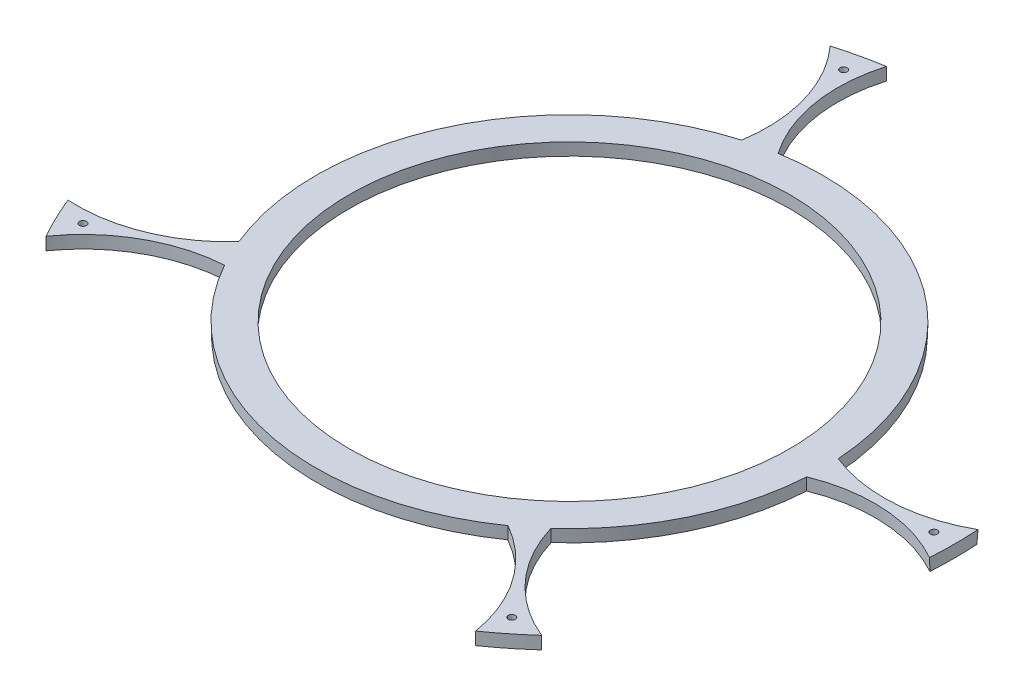
ISO-10303-21;
HEADER;
FILE_DESCRIPTION(('STEP AP214'),'2;1');
FILE_NAME('part.step','',(''),(''),'','','');
FILE_SCHEMA(('AUTOMOTIVE_DESIGN { 1 0 10303 214 1 1 1 1 }'));
ENDSEC;
DATA;
#1=APPLICATION_CONTEXT('core data for automotive mechanical design processes');
#2=APPLICATION_PROTOCOL_DEFINITION('international standard','automotive_design',2000,#1);
#3=PRODUCT_CONTEXT('',#1,'mechanical');
#4=PRODUCT('Part','Part','',(#3));
#5=PRODUCT_RELATED_PRODUCT_CATEGORY('part','',(#4));
#6=PRODUCT_DEFINITION_FORMATION('','',#4);
#7=PRODUCT_DEFINITION_CONTEXT('part definition',#1,'design');
#8=PRODUCT_DEFINITION('design','',#6,#7);
#9=PRODUCT_DEFINITION_SHAPE('','',#8);
#10=(LENGTH_UNIT() NAMED_UNIT(*) SI_UNIT(.MILLI.,.METRE.));
#11=(NAMED_UNIT(*) PLANE_ANGLE_UNIT() SI_UNIT($,.RADIAN.));
#12=(NAMED_UNIT(*) SI_UNIT($,.STERADIAN.) SOLID_ANGLE_UNIT());
#13=UNCERTAINTY_MEASURE_WITH_UNIT(LENGTH_MEASURE(1.E-05),#10,'distance_accuracy_value','');
#14=(GEOMETRIC_REPRESENTATION_CONTEXT(3) GLOBAL_UNCERTAINTY_ASSIGNED_CONTEXT((#13)) GLOBAL_UNIT_ASSIGNED_CONTEXT((#10,
#11,#12)) REPRESENTATION_CONTEXT('',''));
#15=CARTESIAN_POINT('',(0.,0.,0.));
#16=DIRECTION('',(0.,0.,1.));
#17=DIRECTION('',(1.,0.,0.));
#18=AXIS2_PLACEMENT_3D('',#15,#16,#17);
#19=CARTESIAN_POINT('',(0.,0.,0.));
#20=DIRECTION('',(0.,1.,0.));
#21=DIRECTION('',(0.,0.,1.));
#22=AXIS2_PLACEMENT_3D('',#19,#20,#21);
#23=CONICAL_SURFACE('',#22,63.5,0.0349065850398867);
#24=CARTESIAN_POINT('',(-10.3950874879848,3.191075,-62.7563287066158));
#25=CARTESIAN_POINT('',(-10.3832751510703,2.65654921550589,-62.7393649546272));
#26=CARTESIAN_POINT('',(-10.3714431933319,2.12202382325886,-62.7224025511319));
#27=CARTESIAN_POINT('',(-10.3477400362074,1.05297382325886,-62.6884804411279));
#28=CARTESIAN_POINT('',(-10.3358688368212,0.518449215505898,-62.6715207346191));
#29=CARTESIAN_POINT('',(-10.3239780166112,-0.0160749999999876,-62.6545623766036));
#30=B_SPLINE_CURVE_WITH_KNOTS('',3,(#24,#25,#26,#27,#28,#29),.UNSPECIFIED.,.F.,.F.,(4,2,4),(0.,
1.60477600300416,3.20955200600852),.UNSPECIFIED.);
#31=CARTESIAN_POINT('',(-10.3947322436658,3.175,-62.7558185492086));
#32=VERTEX_POINT('',#31);
#33=CARTESIAN_POINT('',(-10.3243356104095,0.,-62.6550723740994));
#34=VERTEX_POINT('',#33);
#35=EDGE_CURVE('E69',#32,#34,#30,.T.);
#36=ORIENTED_EDGE('',*,*,#35,.F.);
#37=CARTESIAN_POINT('',(0.,3.175,0.));
#38=DIRECTION('',(0.,1.,0.));
#39=DIRECTION('',(0.,0.,1.));
#40=AXIS2_PLACEMENT_3D('',#37,#38,#39);
#41=CIRCLE('',#40,63.6108734431363);
#42=CARTESIAN_POINT('',(63.4879267501533,3.175,-3.9530212706064));
#43=VERTEX_POINT('',#42);
#44=EDGE_CURVE('E169',#43,#32,#41,.T.);
#45=ORIENTED_EDGE('',*,*,#44,.F.);
#46=CARTESIAN_POINT('',(63.4879267501533,3.175,-3.9530212706064));
#47=CARTESIAN_POINT('',(63.4702061941256,2.64583343737004,-3.94026697601275));
#48=CARTESIAN_POINT('',(63.452481995248,2.11666682272168,-3.92751991120402));
#49=CARTESIAN_POINT('',(63.4170263117931,1.05833348938835,-3.90204024115636));
#50=CARTESIAN_POINT('',(63.3992948272158,0.529166770703372,-3.88930763591744));
#51=CARTESIAN_POINT('',(63.3815596997886,0.,-3.87658226046342));
#52=B_SPLINE_CURVE_WITH_KNOTS('',3,(#46,#47,#48,#49,#50,#51),.UNSPECIFIED.,.F.,.F.,(4,2,4),(0.,
1.58885036064113,3.17770072128174),.UNSPECIFIED.);
#53=CARTESIAN_POINT('',(63.3815596997886,0.,-3.87658226046343));
#54=VERTEX_POINT('',#53);
#55=EDGE_CURVE('E289',#43,#54,#52,.T.);
#56=ORIENTED_EDGE('',*,*,#55,.T.);
#57=CARTESIAN_POINT('',(0.,0.,0.));
#58=DIRECTION('',(0.,1.,0.));
#59=DIRECTION('',(0.,0.,1.));
#60=AXIS2_PLACEMENT_3D('',#57,#58,#59);
#61=CIRCLE('',#60,63.5);
#62=EDGE_CURVE('E284',#54,#34,#61,.T.);
#63=ORIENTED_EDGE('',*,*,#62,.T.);
#64=EDGE_LOOP('',(#36,#45,#56,#63));
#65=FACE_BOUND('',#64,.T.);
#66=ADVANCED_FACE('F41',(#65),#23,.T.);
#67=CARTESIAN_POINT('',(-17.8633990617881,3.175,-61.0511440855781));
#68=VERTEX_POINT('',#67);
#69=CARTESIAN_POINT('',(-58.8693536283549,3.175,24.0985979587693));
#70=VERTEX_POINT('',#69);
#71=EDGE_CURVE('E61',#68,#70,#41,.T.);
#72=ORIENTED_EDGE('',*,*,#71,.F.);
#73=CARTESIAN_POINT('',(-17.8633003467196,3.191075,-61.0517578562531));
#74=CARTESIAN_POINT('',(-17.8665825983945,2.65654921550589,-61.0313488629204));
#75=CARTESIAN_POINT('',(-17.8698831129101,2.12202382325885,-61.0109325713817));
#76=CARTESIAN_POINT('',(-17.876520667623,1.05297382325885,-60.9700853918924));
#77=CARTESIAN_POINT('',(-17.8798577078202,0.518449215505887,-60.9496545039417));
#78=CARTESIAN_POINT('',(-17.8832130108582,-0.0160750000000003,-60.9292163177851));
#79=B_SPLINE_CURVE_WITH_KNOTS('',3,(#73,#74,#75,#76,#77,#78),.UNSPECIFIED.,.F.,.F.,(4,2,4),(0.,
1.60477600300416,3.20955200600853),.UNSPECIFIED.);
#80=CARTESIAN_POINT('',(-17.883112109599,0.,-60.9298309637858));
#81=VERTEX_POINT('',#80);
#82=EDGE_CURVE('E203',#68,#81,#79,.T.);
#83=ORIENTED_EDGE('',*,*,#82,.T.);
#84=CARTESIAN_POINT('',(-58.7867980947749,0.,24.0075481831063));
#85=VERTEX_POINT('',#84);
#86=EDGE_CURVE('E287',#81,#85,#61,.T.);
#87=ORIENTED_EDGE('',*,*,#86,.T.);
#88=CARTESIAN_POINT('',(-58.8697719457532,3.191075,24.0990578170742));
#89=CARTESIAN_POINT('',(-58.8558620026866,2.65654921550589,24.0837668501723));
#90=CARTESIAN_POINT('',(-58.8419577403478,2.12202382325885,24.0684570544494));
#91=CARTESIAN_POINT('',(-58.8141605771258,1.05297382325885,24.037799805362));
#92=CARTESIAN_POINT('',(-58.8002676762425,0.518449215505887,24.0224523519975));
#93=CARTESIAN_POINT('',(-58.7863804560871,-0.0160750000000004,24.007086069812));
#94=B_SPLINE_CURVE_WITH_KNOTS('',3,(#88,#89,#90,#91,#92,#93),.UNSPECIFIED.,.F.,.F.,(4,2,4),(0.,
1.60477600300416,3.20955200600853),.UNSPECIFIED.);
#95=EDGE_CURVE('E240',#70,#85,#94,.T.);
#96=ORIENTED_EDGE('',*,*,#95,.F.);
#97=EDGE_LOOP('',(#72,#83,#87,#96));
#98=FACE_BOUND('',#97,.T.);
#99=ADVANCED_FACE('F364',(#98),#23,.T.);
#100=CARTESIAN_POINT('',(-55.5454841968008,3.175,31.0006839528044));
#101=VERTEX_POINT('',#100);
#102=CARTESIAN_POINT('',(36.5940593452384,3.175,52.0309334995623));
#103=VERTEX_POINT('',#102);
#104=EDGE_CURVE('E375',#101,#103,#41,.T.);
#105=ORIENTED_EDGE('',*,*,#104,.F.);
#106=CARTESIAN_POINT('',(-55.5461045451327,3.191075,31.0007242895526));
#107=CARTESIAN_POINT('',(-55.525476878165,2.65654921550589,30.9993828200677));
#108=CARTESIAN_POINT('',(-55.5048380321081,2.12202382325885,30.9980575315325));
#109=CARTESIAN_POINT('',(-55.4635379818162,1.05297382325885,30.9954393163612));
#110=CARTESIAN_POINT('',(-55.4428767775811,0.518449215505887,30.9941463897252));
#111=CARTESIAN_POINT('',(-55.4222043942569,-0.0160750000000003,30.9928696440389));
#112=B_SPLINE_CURVE_WITH_KNOTS('',3,(#106,#107,#108,#109,#110,#111),.UNSPECIFIED.,.F.,.F.,(4,2,
4),(0.,1.60477600300416,3.20955200600853),.UNSPECIFIED.);
#113=CARTESIAN_POINT('',(-55.4228260824416,0.,30.992908044187));
#114=VERTEX_POINT('',#113);
#115=EDGE_CURVE('E232',#101,#114,#112,.T.);
#116=ORIENTED_EDGE('',*,*,#115,.T.);
#117=CARTESIAN_POINT('',(36.4869220431112,0.,51.9707082866871));
#118=VERTEX_POINT('',#117);
#119=EDGE_CURVE('E617',#114,#118,#61,.T.);
#120=ORIENTED_EDGE('',*,*,#119,.T.);
#121=CARTESIAN_POINT('',(36.5946007583137,3.191075,52.0312390007705));
#122=CARTESIAN_POINT('',(36.5765979143543,2.65654921550589,52.0210803692541));
#123=CARTESIAN_POINT('',(36.5585779777327,2.12202382325885,52.0109314658447));
#124=CARTESIAN_POINT('',(36.5225039191651,1.05297382325885,51.9906531152395));
#125=CARTESIAN_POINT('',(36.5044497972192,0.518449215505887,51.9805236680438));
#126=CARTESIAN_POINT('',(36.4863785826111,-0.0160749999999998,51.970403948955));
#127=B_SPLINE_CURVE_WITH_KNOTS('',3,(#121,#122,#123,#124,#125,#126),.UNSPECIFIED.,.F.,.F.,(4,2,
4),(0.,1.60477600300416,3.20955200600853),.UNSPECIFIED.);
#128=EDGE_CURVE('E54',#103,#118,#127,.T.);
#129=ORIENTED_EDGE('',*,*,#128,.F.);
#130=EDGE_LOOP('',(#105,#116,#120,#129));
#131=FACE_BOUND('',#130,.T.);
#132=ADVANCED_FACE('F353',(#131),#23,.T.);
#133=CARTESIAN_POINT('',(0.,3.175,0.));
#134=DIRECTION('',(0.,1.,0.));
#135=DIRECTION('',(0.,0.,1.));
#136=AXIS2_PLACEMENT_3D('',#133,#134,#135);
#137=PLANE('',#136);
#138=CARTESIAN_POINT('',(-20.3473142009645,3.175,-89.1474082899061));
#139=DIRECTION('',(0.,1.,0.));
#140=DIRECTION('',(0.974927912181826,0.,-0.222520933956305));
#141=AXIS2_PLACEMENT_3D('',#138,#139,#140);
#142=CIRCLE('',#141,0.889000000000003);
#143=CARTESIAN_POINT('',(-19.4806032870349,3.175,-89.3452294001933));
#144=VERTEX_POINT('',#143);
#145=EDGE_CURVE('E577',#144,#144,#142,.T.);
#146=ORIENTED_EDGE('',*,*,#145,.F.);
#147=EDGE_LOOP('',(#146));
#148=FACE_BOUND('',#147,.T.);
#149=CARTESIAN_POINT('',(-82.3845932809974,3.175,39.674329104909));
#150=DIRECTION('',(0.,1.,0.));
#151=DIRECTION('',(-0.433883739117553,0.,-0.900968867902422));
#152=AXIS2_PLACEMENT_3D('',#149,#150,#151);
#153=CIRCLE('',#152,0.889000000000003);
#154=CARTESIAN_POINT('',(-82.7703159250729,3.175,38.8733677813438));
#155=VERTEX_POINT('',#154);
#156=EDGE_CURVE('E579',#155,#155,#153,.T.);
#157=ORIENTED_EDGE('',*,*,#156,.F.);
#158=EDGE_LOOP('',(#157));
#159=FACE_BOUND('',#158,.T.);
#160=CARTESIAN_POINT('',(57.0119074819625,3.175,71.4906707568768));
#161=DIRECTION('',(0.,1.,0.));
#162=DIRECTION('',(-0.781831482468031,0.,0.623489801858732));
#163=AXIS2_PLACEMENT_3D('',#160,#161,#162);
#164=CIRCLE('',#163,0.889000000000003);
#165=CARTESIAN_POINT('',(56.3168592940484,3.175,72.0449531907292));
#166=VERTEX_POINT('',#165);
#167=EDGE_CURVE('E189',#166,#166,#164,.T.);
#168=ORIENTED_EDGE('',*,*,#167,.F.);
#169=EDGE_LOOP('',(#168));
#170=FACE_BOUND('',#169,.T.);
#171=ORIENTED_EDGE('',*,*,#44,.T.);
#172=CARTESIAN_POINT('',(20.8714555891353,3.175,-84.5281748388711));
#173=DIRECTION('',(0.,-1.,0.));
#174=DIRECTION('',(-0.974927912181826,0.,0.222520933956305));
#175=AXIS2_PLACEMENT_3D('',#172,#173,#174);
#176=CIRCLE('',#175,38.1);
#177=CARTESIAN_POINT('',(-15.6929901278225,3.175,-95.2357100086311));
#178=VERTEX_POINT('',#177);
#179=EDGE_CURVE('E160',#32,#178,#176,.T.);
#180=ORIENTED_EDGE('',*,*,#179,.T.);
#181=CARTESIAN_POINT('',(0.,3.175,0.));
#182=DIRECTION('',(0.,-1.,0.));
#183=DIRECTION('',(-0.974927912181826,0.,0.222520933956305));
#184=AXIS2_PLACEMENT_3D('',#181,#182,#183);
#185=CIRCLE('',#184,96.52);
#186=CARTESIAN_POINT('',(-27.1823304065904,3.175,-92.6133430649545));
#187=VERTEX_POINT('',#186);
#188=EDGE_CURVE('E166',#178,#187,#185,.F.);
#189=ORIENTED_EDGE('',*,*,#188,.T.);
#190=CARTESIAN_POINT('',(-55.4799322734896,3.175,-67.1014687985964));
#191=DIRECTION('',(0.,-1.,0.));
#192=DIRECTION('',(-0.974927912181826,0.,0.222520933956305));
#193=AXIS2_PLACEMENT_3D('',#190,#191,#192);
#194=CIRCLE('',#193,38.1);
#195=EDGE_CURVE('E171',#68,#187,#194,.F.);
#196=ORIENTED_EDGE('',*,*,#195,.F.);
#197=ORIENTED_EDGE('',*,*,#71,.T.);
#198=CARTESIAN_POINT('',(-87.0532128069228,3.175,-1.53887621094279));
#199=DIRECTION('',(0.,-1.,0.));
#200=DIRECTION('',(0.433883739117553,0.,0.900968867902422));
#201=AXIS2_PLACEMENT_3D('',#198,#199,#200);
#202=CIRCLE('',#201,38.1);
#203=CARTESIAN_POINT('',(-89.3559331040579,3.175,36.4914732383216));
#204=VERTEX_POINT('',#203);
#205=EDGE_CURVE('E388',#70,#204,#202,.T.);
#206=ORIENTED_EDGE('',*,*,#205,.T.);
#207=CARTESIAN_POINT('',(0.,3.175,0.));
#208=DIRECTION('',(0.,-1.,0.));
#209=DIRECTION('',(0.433883739117553,0.,0.900968867902422));
#210=AXIS2_PLACEMENT_3D('',#207,#208,#209);
#211=CIRCLE('',#210,96.52);
#212=CARTESIAN_POINT('',(-84.2426956453113,3.175,47.1092202271642));
#213=VERTEX_POINT('',#212);
#214=EDGE_CURVE('E385',#204,#213,#211,.F.);
#215=ORIENTED_EDGE('',*,*,#214,.T.);
#216=CARTESIAN_POINT('',(-53.0736485348191,3.175,69.0204160462866));
#217=DIRECTION('',(0.,-1.,0.));
#218=DIRECTION('',(0.433883739117553,0.,0.900968867902422));
#219=AXIS2_PLACEMENT_3D('',#216,#217,#218);
#220=CIRCLE('',#219,38.1);
#221=EDGE_CURVE('E380',#101,#213,#220,.F.);
#222=ORIENTED_EDGE('',*,*,#221,.F.);
#223=ORIENTED_EDGE('',*,*,#104,.T.);
#224=CARTESIAN_POINT('',(17.8708688462539,3.175,85.2130391822753));
#225=DIRECTION('',(0.,-1.,0.));
#226=DIRECTION('',(0.781831482468031,0.,-0.623489801858732));
#227=AXIS2_PLACEMENT_3D('',#224,#225,#226);
#228=CIRCLE('',#227,38.1);
#229=CARTESIAN_POINT('',(55.460121505529,3.175,78.9954765957644));
#230=VERTEX_POINT('',#229);
#231=EDGE_CURVE('E248',#103,#230,#228,.T.);
#232=ORIENTED_EDGE('',*,*,#231,.T.);
#233=CARTESIAN_POINT('',(0.,3.175,0.));
#234=DIRECTION('',(0.,-1.,0.));
#235=DIRECTION('',(0.781831482468031,0.,-0.623489801858732));
#236=AXIS2_PLACEMENT_3D('',#233,#234,#235);
#237=CIRCLE('',#236,96.52);
#238=CARTESIAN_POINT('',(64.6738570345755,3.175,71.6477676991496));
#239=VERTEX_POINT('',#238);
#240=EDGE_CURVE('E245',#230,#239,#237,.F.);
#241=ORIENTED_EDGE('',*,*,#240,.T.);
#242=CARTESIAN_POINT('',(79.0999279543643,3.175,36.3844939172497));
#243=DIRECTION('',(0.,-1.,0.));
#244=DIRECTION('',(0.781831482468031,0.,-0.623489801858732));
#245=AXIS2_PLACEMENT_3D('',#242,#243,#244);
#246=CIRCLE('',#245,38.1);
#247=CARTESIAN_POINT('',(42.5834651028442,3.175,47.2545417926527));
#248=VERTEX_POINT('',#247);
#249=EDGE_CURVE('E251',#248,#239,#246,.F.);
#250=ORIENTED_EDGE('',*,*,#249,.F.);
#251=CARTESIAN_POINT('',(63.4879267501533,3.175,3.9530212706064));
#252=VERTEX_POINT('',#251);
#253=EDGE_CURVE('E286',#248,#252,#41,.T.);
#254=ORIENTED_EDGE('',*,*,#253,.T.);
#255=CARTESIAN_POINT('',(77.764541225479,3.175,39.1574530324788));
#256=DIRECTION('',(0.,1.,0.));
#257=DIRECTION('',(0.,0.,1.));
#258=AXIS2_PLACEMENT_3D('',#255,#256,#257);
#259=CIRCLE('',#258,37.9891265568637);
#260=CARTESIAN_POINT('',(96.4396881604208,3.175,6.07554523513829));
#261=VERTEX_POINT('',#260);
#262=EDGE_CURVE('E327',#252,#261,#259,.F.);
#263=ORIENTED_EDGE('',*,*,#262,.T.);
#264=CARTESIAN_POINT('',(0.,3.175,0.));
#265=DIRECTION('',(0.,1.,0.));
#266=DIRECTION('',(0.,0.,1.));
#267=AXIS2_PLACEMENT_3D('',#264,#265,#266);
#268=CIRCLE('',#267,96.6308734431363);
#269=CARTESIAN_POINT('',(96.4396881604208,3.175,-6.07554523513829));
#270=VERTEX_POINT('',#269);
#271=EDGE_CURVE('E278',#261,#270,#268,.T.);
#272=ORIENTED_EDGE('',*,*,#271,.T.);
#273=CARTESIAN_POINT('',(77.764541225479,3.175,-39.1574530324788));
#274=DIRECTION('',(0.,1.,0.));
#275=DIRECTION('',(0.,0.,1.));
#276=AXIS2_PLACEMENT_3D('',#273,#274,#275);
#277=CIRCLE('',#276,37.9891265568637);
#278=EDGE_CURVE('E319',#43,#270,#277,.T.);
#279=ORIENTED_EDGE('',*,*,#278,.F.);
#280=EDGE_LOOP('',(#171,#180,#189,#196,#197,#206,#215,#222,#223,#232,#241,#250,#254,#263,#272,#279));
#281=FACE_BOUND('',#280,.T.);
#282=CARTESIAN_POINT('',(91.44,3.175,0.));
#283=DIRECTION('',(0.,1.,0.));
#284=DIRECTION('',(0.,0.,1.));
#285=AXIS2_PLACEMENT_3D('',#282,#283,#284);
#286=CIRCLE('',#285,0.889000000000003);
#287=CARTESIAN_POINT('',(91.44,3.175,0.889000000000003));
#288=VERTEX_POINT('',#287);
#289=EDGE_CURVE('E262',#288,#288,#286,.T.);
#290=ORIENTED_EDGE('',*,*,#289,.F.);
#291=EDGE_LOOP('',(#290));
#292=FACE_BOUND('',#291,.T.);
#293=CARTESIAN_POINT('',(0.,3.175,0.));
#294=DIRECTION('',(0.,1.,0.));
#295=DIRECTION('',(0.,0.,1.));
#296=AXIS2_PLACEMENT_3D('',#293,#294,#295);
#297=CIRCLE('',#296,55.2611265568637);
#298=CARTESIAN_POINT('',(0.,3.175,55.2611265568637));
#299=VERTEX_POINT('',#298);
#300=EDGE_CURVE('E282',#299,#299,#297,.T.);
#301=ORIENTED_EDGE('',*,*,#300,.F.);
#302=EDGE_LOOP('',(#301));
#303=FACE_BOUND('',#302,.T.);
#304=ADVANCED_FACE('F162',(#148,#159,#170,#281,#292,#303),#137,.T.);
#305=CARTESIAN_POINT('',(0.,0.,0.));
#306=DIRECTION('',(0.,1.,0.));
#307=DIRECTION('',(0.,0.,1.));
#308=AXIS2_PLACEMENT_3D('',#305,#306,#307);
#309=PLANE('',#308);
#310=CARTESIAN_POINT('',(-20.3473142009645,0.,-89.1474082899061));
#311=DIRECTION('',(0.,1.,0.));
#312=DIRECTION('',(0.974927912181826,0.,-0.222520933956305));
#313=AXIS2_PLACEMENT_3D('',#310,#311,#312);
#314=CIRCLE('',#313,0.889000000000003);
#315=CARTESIAN_POINT('',(-19.4806032870349,0.,-89.3452294001933));
#316=VERTEX_POINT('',#315);
#317=EDGE_CURVE('E574',#316,#316,#314,.T.);
#318=ORIENTED_EDGE('',*,*,#317,.T.);
#319=EDGE_LOOP('',(#318));
#320=FACE_BOUND('',#319,.T.);
#321=CARTESIAN_POINT('',(-82.3845932809974,0.,39.674329104909));
#322=DIRECTION('',(0.,1.,0.));
#323=DIRECTION('',(-0.433883739117553,0.,-0.900968867902422));
#324=AXIS2_PLACEMENT_3D('',#321,#322,#323);
#325=CIRCLE('',#324,0.889000000000003);
#326=CARTESIAN_POINT('',(-82.7703159250729,0.,38.8733677813438));
#327=VERTEX_POINT('',#326);
#328=EDGE_CURVE('E582',#327,#327,#325,.T.);
#329=ORIENTED_EDGE('',*,*,#328,.T.);
#330=EDGE_LOOP('',(#329));
#331=FACE_BOUND('',#330,.T.);
#332=CARTESIAN_POINT('',(57.0119074819625,0.,71.4906707568768));
#333=DIRECTION('',(0.,1.,0.));
#334=DIRECTION('',(-0.781831482468031,0.,0.623489801858732));
#335=AXIS2_PLACEMENT_3D('',#332,#333,#334);
#336=CIRCLE('',#335,0.889000000000003);
#337=CARTESIAN_POINT('',(56.3168592940484,0.,72.0449531907292));
#338=VERTEX_POINT('',#337);
#339=EDGE_CURVE('E195',#338,#338,#336,.T.);
#340=ORIENTED_EDGE('',*,*,#339,.T.);
#341=EDGE_LOOP('',(#340));
#342=FACE_BOUND('',#341,.T.);
#343=CARTESIAN_POINT('',(91.44,0.,0.));
#344=DIRECTION('',(0.,1.,0.));
#345=DIRECTION('',(0.,0.,1.));
#346=AXIS2_PLACEMENT_3D('',#343,#344,#345);
#347=CIRCLE('',#346,0.889000000000003);
#348=CARTESIAN_POINT('',(91.44,0.,0.889000000000003));
#349=VERTEX_POINT('',#348);
#350=EDGE_CURVE('E265',#349,#349,#347,.T.);
#351=ORIENTED_EDGE('',*,*,#350,.T.);
#352=EDGE_LOOP('',(#351));
#353=FACE_BOUND('',#352,.T.);
#354=ORIENTED_EDGE('',*,*,#62,.F.);
#355=CARTESIAN_POINT('',(77.764541225479,0.,-39.1574530324788));
#356=DIRECTION('',(0.,-1.,0.));
#357=DIRECTION('',(0.,0.,-1.));
#358=AXIS2_PLACEMENT_3D('',#355,#356,#357);
#359=CIRCLE('',#358,38.1);
#360=CARTESIAN_POINT('',(96.3399707436786,0.,-5.89240503590441));
#361=VERTEX_POINT('',#360);
#362=EDGE_CURVE('E275',#54,#361,#359,.F.);
#363=ORIENTED_EDGE('',*,*,#362,.T.);
#364=CARTESIAN_POINT('',(0.,0.,0.));
#365=DIRECTION('',(0.,-1.,0.));
#366=DIRECTION('',(0.,0.,-1.));
#367=AXIS2_PLACEMENT_3D('',#364,#365,#366);
#368=CIRCLE('',#367,96.52);
#369=CARTESIAN_POINT('',(96.3399707436786,0.,5.89240503590441));
#370=VERTEX_POINT('',#369);
#371=EDGE_CURVE('E268',#370,#361,#368,.F.);
#372=ORIENTED_EDGE('',*,*,#371,.F.);
#373=CARTESIAN_POINT('',(77.764541225479,0.,39.1574530324788));
#374=DIRECTION('',(0.,-1.,0.));
#375=DIRECTION('',(0.,0.,-1.));
#376=AXIS2_PLACEMENT_3D('',#373,#374,#375);
#377=CIRCLE('',#376,38.1);
#378=CARTESIAN_POINT('',(63.3815596997886,0.,3.87658226046343));
#379=VERTEX_POINT('',#378);
#380=EDGE_CURVE('E273',#379,#370,#377,.T.);
#381=ORIENTED_EDGE('',*,*,#380,.F.);
#382=CARTESIAN_POINT('',(42.548590154326,0.,47.1366892757563));
#383=VERTEX_POINT('',#382);
#384=EDGE_CURVE('E288',#383,#379,#61,.T.);
#385=ORIENTED_EDGE('',*,*,#384,.F.);
#386=CARTESIAN_POINT('',(79.0999279543643,0.,36.3844939172497));
#387=DIRECTION('',(0.,-1.,0.));
#388=DIRECTION('',(0.781831482468031,0.,-0.623489801858732));
#389=AXIS2_PLACEMENT_3D('',#386,#387,#388);
#390=CIRCLE('',#389,38.1);
#391=CARTESIAN_POINT('',(64.6738570345755,0.,71.6477676991496));
#392=VERTEX_POINT('',#391);
#393=EDGE_CURVE('E249',#383,#392,#390,.F.);
#394=ORIENTED_EDGE('',*,*,#393,.T.);
#395=CARTESIAN_POINT('',(0.,0.,0.));
#396=DIRECTION('',(0.,-1.,0.));
#397=DIRECTION('',(0.781831482468031,0.,-0.623489801858732));
#398=AXIS2_PLACEMENT_3D('',#395,#396,#397);
#399=CIRCLE('',#398,96.52);
#400=CARTESIAN_POINT('',(55.460121505529,0.,78.9954765957644));
#401=VERTEX_POINT('',#400);
#402=EDGE_CURVE('E239',#401,#392,#399,.F.);
#403=ORIENTED_EDGE('',*,*,#402,.F.);
#404=CARTESIAN_POINT('',(17.8708688462539,0.,85.2130391822753));
#405=DIRECTION('',(0.,-1.,0.));
#406=DIRECTION('',(0.781831482468031,0.,-0.623489801858732));
#407=AXIS2_PLACEMENT_3D('',#404,#405,#406);
#408=CIRCLE('',#407,38.1);
#409=EDGE_CURVE('E256',#118,#401,#408,.T.);
#410=ORIENTED_EDGE('',*,*,#409,.F.);
#411=ORIENTED_EDGE('',*,*,#119,.F.);
#412=CARTESIAN_POINT('',(-53.0736485348191,0.,69.0204160462866));
#413=DIRECTION('',(0.,-1.,0.));
#414=DIRECTION('',(0.433883739117553,0.,0.900968867902422));
#415=AXIS2_PLACEMENT_3D('',#412,#413,#414);
#416=CIRCLE('',#415,38.1);
#417=CARTESIAN_POINT('',(-84.2426956453113,0.,47.1092202271642));
#418=VERTEX_POINT('',#417);
#419=EDGE_CURVE('E383',#114,#418,#416,.F.);
#420=ORIENTED_EDGE('',*,*,#419,.T.);
#421=CARTESIAN_POINT('',(0.,0.,0.));
#422=DIRECTION('',(0.,-1.,0.));
#423=DIRECTION('',(0.433883739117553,0.,0.900968867902422));
#424=AXIS2_PLACEMENT_3D('',#421,#422,#423);
#425=CIRCLE('',#424,96.52);
#426=CARTESIAN_POINT('',(-89.3559331040579,0.,36.4914732383216));
#427=VERTEX_POINT('',#426);
#428=EDGE_CURVE('E394',#427,#418,#425,.F.);
#429=ORIENTED_EDGE('',*,*,#428,.F.);
#430=CARTESIAN_POINT('',(-87.0532128069228,0.,-1.53887621094279));
#431=DIRECTION('',(0.,-1.,0.));
#432=DIRECTION('',(0.433883739117553,0.,0.900968867902422));
#433=AXIS2_PLACEMENT_3D('',#430,#431,#432);
#434=CIRCLE('',#433,38.1);
#435=EDGE_CURVE('E397',#85,#427,#434,.T.);
#436=ORIENTED_EDGE('',*,*,#435,.F.);
#437=ORIENTED_EDGE('',*,*,#86,.F.);
#438=CARTESIAN_POINT('',(-55.4799322734896,0.,-67.1014687985964));
#439=DIRECTION('',(0.,-1.,0.));
#440=DIRECTION('',(-0.974927912181826,0.,0.222520933956305));
#441=AXIS2_PLACEMENT_3D('',#438,#439,#440);
#442=CIRCLE('',#441,38.1);
#443=CARTESIAN_POINT('',(-27.1823304065904,0.,-92.6133430649545));
#444=VERTEX_POINT('',#443);
#445=EDGE_CURVE('E184',#81,#444,#442,.F.);
#446=ORIENTED_EDGE('',*,*,#445,.T.);
#447=CARTESIAN_POINT('',(0.,0.,0.));
#448=DIRECTION('',(0.,-1.,0.));
#449=DIRECTION('',(-0.974927912181826,0.,0.222520933956305));
#450=AXIS2_PLACEMENT_3D('',#447,#448,#449);
#451=CIRCLE('',#450,96.52);
#452=CARTESIAN_POINT('',(-15.6929901278225,0.,-95.2357100086311));
#453=VERTEX_POINT('',#452);
#454=EDGE_CURVE('E193',#453,#444,#451,.F.);
#455=ORIENTED_EDGE('',*,*,#454,.F.);
#456=CARTESIAN_POINT('',(20.8714555891353,0.,-84.5281748388711));
#457=DIRECTION('',(0.,-1.,0.));
#458=DIRECTION('',(-0.974927912181826,0.,0.222520933956305));
#459=AXIS2_PLACEMENT_3D('',#456,#457,#458);
#460=CIRCLE('',#459,38.1);
#461=EDGE_CURVE('E177',#34,#453,#460,.T.);
#462=ORIENTED_EDGE('',*,*,#461,.F.);
#463=EDGE_LOOP('',(#354,#363,#372,#381,#385,#394,#403,#410,#411,#420,#429,#436,#437,#446,#455,#462));
#464=FACE_BOUND('',#463,.T.);
#465=CARTESIAN_POINT('',(0.,0.,0.));
#466=DIRECTION('',(0.,1.,0.));
#467=DIRECTION('',(0.,0.,1.));
#468=AXIS2_PLACEMENT_3D('',#465,#466,#467);
#469=CIRCLE('',#468,55.372);
#470=CARTESIAN_POINT('',(0.,0.,55.372));
#471=VERTEX_POINT('',#470);
#472=EDGE_CURVE('E279',#471,#471,#469,.T.);
#473=ORIENTED_EDGE('',*,*,#472,.T.);
#474=EDGE_LOOP('',(#473));
#475=FACE_BOUND('',#474,.T.);
#476=ADVANCED_FACE('F352',(#320,#331,#342,#353,#464,#475),#309,.F.);
#477=ORIENTED_EDGE('',*,*,#253,.F.);
#478=CARTESIAN_POINT('',(42.5836424687561,3.191075,47.2551376117859));
#479=CARTESIAN_POINT('',(42.5777445449929,2.65654921550589,47.2353256285385));
#480=CARTESIAN_POINT('',(42.5718599089079,2.12202382325885,47.2154991458851));
#481=CARTESIAN_POINT('',(42.5601172120939,1.05297382325885,47.1758171817662));
#482=CARTESIAN_POINT('',(42.554259151365,0.518449215505888,47.1559617003007));
#483=CARTESIAN_POINT('',(42.5484143783142,-0.0160749999999995,47.1360917194292));
#484=B_SPLINE_CURVE_WITH_KNOTS('',3,(#478,#479,#480,#481,#482,#483),.UNSPECIFIED.,.F.,.F.,(4,2,
4),(0.,1.60477600300416,3.20955200600853),.UNSPECIFIED.);
#485=EDGE_CURVE('E11',#248,#383,#484,.T.);
#486=ORIENTED_EDGE('',*,*,#485,.T.);
#487=ORIENTED_EDGE('',*,*,#384,.T.);
#488=CARTESIAN_POINT('',(63.4879267501533,3.175,3.9530212706064));
#489=CARTESIAN_POINT('',(63.4702061941256,2.64583343737004,3.94026697601275));
#490=CARTESIAN_POINT('',(63.452481995248,2.11666682272168,3.92751991120402));
#491=CARTESIAN_POINT('',(63.4170263117931,1.05833348938835,3.90204024115636));
#492=CARTESIAN_POINT('',(63.3992948272158,0.529166770703372,3.88930763591744));
#493=CARTESIAN_POINT('',(63.3815596997886,0.,3.87658226046342));
#494=B_SPLINE_CURVE_WITH_KNOTS('',3,(#488,#489,#490,#491,#492,#493),.UNSPECIFIED.,.F.,.F.,(4,2,
4),(0.,1.58885036064113,3.17770072128174),.UNSPECIFIED.);
#495=EDGE_CURVE('E295',#252,#379,#494,.T.);
#496=ORIENTED_EDGE('',*,*,#495,.F.);
#497=EDGE_LOOP('',(#477,#486,#487,#496));
#498=FACE_BOUND('',#497,.T.);
#499=ADVANCED_FACE('F209',(#498),#23,.T.);
#500=CARTESIAN_POINT('',(0.,0.,0.));
#501=DIRECTION('',(0.,-1.,0.));
#502=DIRECTION('',(0.,0.,1.));
#503=AXIS2_PLACEMENT_3D('',#500,#501,#502);
#504=CONICAL_SURFACE('',#503,55.372,0.0349065850398867);
#505=ORIENTED_EDGE('',*,*,#300,.T.);
#506=EDGE_LOOP('',(#505));
#507=FACE_BOUND('',#506,.T.);
#508=ORIENTED_EDGE('',*,*,#472,.F.);
#509=EDGE_LOOP('',(#508));
#510=FACE_BOUND('',#509,.T.);
#511=ADVANCED_FACE('F43',(#507,#510),#504,.F.);
#512=CARTESIAN_POINT('',(0.,0.,0.));
#513=DIRECTION('',(0.,1.,0.));
#514=DIRECTION('',(0.,0.,-1.));
#515=AXIS2_PLACEMENT_3D('',#512,#513,#514);
#516=CONICAL_SURFACE('',#515,96.52,0.0349065850398867);
#517=ORIENTED_EDGE('',*,*,#371,.T.);
#518=CARTESIAN_POINT('',(96.4396881604208,3.175,-6.07554523513829));
#519=CARTESIAN_POINT('',(96.42309942908,2.64583587976127,-6.04496093158767));
#520=CARTESIAN_POINT('',(96.406495278681,2.11667048630692,-6.01440709654277));
#521=CARTESIAN_POINT('',(96.373256139767,1.05833715297359,-5.95336036346482));
#522=CARTESIAN_POINT('',(96.3566211512519,0.5291692130946,-5.92286746543175));
#523=CARTESIAN_POINT('',(96.3399707436786,0.,-5.89240503590441));
#524=B_SPLINE_CURVE_WITH_KNOTS('',3,(#518,#519,#520,#521,#522,#523),.UNSPECIFIED.,.F.,.F.,(4,2,
4),(0.,1.59092024768214,3.18184049534453),.UNSPECIFIED.);
#525=EDGE_CURVE('E283',#270,#361,#524,.T.);
#526=ORIENTED_EDGE('',*,*,#525,.F.);
#527=ORIENTED_EDGE('',*,*,#271,.F.);
#528=CARTESIAN_POINT('',(96.4396881604208,3.175,6.07554523513829));
#529=CARTESIAN_POINT('',(96.42309942908,2.64583587976127,6.04496093158767));
#530=CARTESIAN_POINT('',(96.406495278681,2.11667048630692,6.01440709654277));
#531=CARTESIAN_POINT('',(96.373256139767,1.05833715297359,5.95336036346482));
#532=CARTESIAN_POINT('',(96.3566211512519,0.5291692130946,5.92286746543175));
#533=CARTESIAN_POINT('',(96.3399707436786,0.,5.89240503590441));
#534=B_SPLINE_CURVE_WITH_KNOTS('',3,(#528,#529,#530,#531,#532,#533),.UNSPECIFIED.,.F.,.F.,(4,2,
4),(0.,1.59092024768214,3.18184049534453),.UNSPECIFIED.);
#535=EDGE_CURVE('E313',#261,#370,#534,.T.);
#536=ORIENTED_EDGE('',*,*,#535,.T.);
#537=EDGE_LOOP('',(#517,#526,#527,#536));
#538=FACE_BOUND('',#537,.T.);
#539=ADVANCED_FACE('F305',(#538),#516,.T.);
#540=CARTESIAN_POINT('',(77.764541225479,0.,-39.1574530324788));
#541=DIRECTION('',(0.,-1.,0.));
#542=DIRECTION('',(0.,0.,-1.));
#543=AXIS2_PLACEMENT_3D('',#540,#541,#542);
#544=CONICAL_SURFACE('',#543,38.1,0.0349065850398867);
#545=ORIENTED_EDGE('',*,*,#362,.F.);
#546=ORIENTED_EDGE('',*,*,#55,.F.);
#547=ORIENTED_EDGE('',*,*,#278,.T.);
#548=ORIENTED_EDGE('',*,*,#525,.T.);
#549=EDGE_LOOP('',(#545,#546,#547,#548));
#550=FACE_BOUND('',#549,.T.);
#551=ADVANCED_FACE('F301',(#550),#544,.F.);
#552=CARTESIAN_POINT('',(77.764541225479,0.,39.1574530324788));
#553=DIRECTION('',(0.,-1.,0.));
#554=DIRECTION('',(0.,0.,-1.));
#555=AXIS2_PLACEMENT_3D('',#552,#553,#554);
#556=CONICAL_SURFACE('',#555,38.1,0.0349065850398867);
#557=ORIENTED_EDGE('',*,*,#380,.T.);
#558=ORIENTED_EDGE('',*,*,#535,.F.);
#559=ORIENTED_EDGE('',*,*,#262,.F.);
#560=ORIENTED_EDGE('',*,*,#495,.T.);
#561=EDGE_LOOP('',(#557,#558,#559,#560));
#562=FACE_BOUND('',#561,.T.);
#563=ADVANCED_FACE('F304',(#562),#556,.F.);
#564=CARTESIAN_POINT('',(91.44,0.,0.));
#565=DIRECTION('',(0.,1.,0.));
#566=DIRECTION('',(0.,0.,1.));
#567=AXIS2_PLACEMENT_3D('',#564,#565,#566);
#568=CYLINDRICAL_SURFACE('',#567,0.889000000000003);
#569=ORIENTED_EDGE('',*,*,#350,.F.);
#570=EDGE_LOOP('',(#569));
#571=FACE_BOUND('',#570,.T.);
#572=ORIENTED_EDGE('',*,*,#289,.T.);
#573=EDGE_LOOP('',(#572));
#574=FACE_BOUND('',#573,.T.);
#575=ADVANCED_FACE('F347',(#571,#574),#568,.F.);
#576=CARTESIAN_POINT('',(79.0999279543643,3.175,36.3844939172497));
#577=DIRECTION('',(0.,-1.,0.));
#578=DIRECTION('',(0.,0.,-1.));
#579=AXIS2_PLACEMENT_3D('',#576,#577,#578);
#580=CYLINDRICAL_SURFACE('',#579,38.1);
#581=ORIENTED_EDGE('',*,*,#485,.F.);
#582=ORIENTED_EDGE('',*,*,#249,.T.);
#583=DIRECTION('',(0.,-1.,0.));
#584=VECTOR('',#583,1.);
#585=CARTESIAN_POINT('',(64.6738570345755,3.175,71.6477676991496));
#586=LINE('',#585,#584);
#587=EDGE_CURVE('E260',#239,#392,#586,.T.);
#588=ORIENTED_EDGE('',*,*,#587,.T.);
#589=ORIENTED_EDGE('',*,*,#393,.F.);
#590=EDGE_LOOP('',(#581,#582,#588,#589));
#591=FACE_BOUND('',#590,.T.);
#592=ADVANCED_FACE('F341',(#591),#580,.F.);
#593=CARTESIAN_POINT('',(17.8708688462539,3.175,85.2130391822753));
#594=DIRECTION('',(0.,-1.,0.));
#595=DIRECTION('',(0.,0.,-1.));
#596=AXIS2_PLACEMENT_3D('',#593,#594,#595);
#597=CYLINDRICAL_SURFACE('',#596,38.1);
#598=ORIENTED_EDGE('',*,*,#231,.F.);
#599=ORIENTED_EDGE('',*,*,#128,.T.);
#600=ORIENTED_EDGE('',*,*,#409,.T.);
#601=DIRECTION('',(0.,-1.,0.));
#602=VECTOR('',#601,1.);
#603=CARTESIAN_POINT('',(55.460121505529,3.175,78.9954765957644));
#604=LINE('',#603,#602);
#605=EDGE_CURVE('E253',#230,#401,#604,.T.);
#606=ORIENTED_EDGE('',*,*,#605,.F.);
#607=EDGE_LOOP('',(#598,#599,#600,#606));
#608=FACE_BOUND('',#607,.T.);
#609=ADVANCED_FACE('F337',(#608),#597,.F.);
#610=CARTESIAN_POINT('',(0.,3.175,0.));
#611=DIRECTION('',(0.,-1.,0.));
#612=DIRECTION('',(0.,0.,-1.));
#613=AXIS2_PLACEMENT_3D('',#610,#611,#612);
#614=CYLINDRICAL_SURFACE('',#613,96.52);
#615=ORIENTED_EDGE('',*,*,#402,.T.);
#616=ORIENTED_EDGE('',*,*,#587,.F.);
#617=ORIENTED_EDGE('',*,*,#240,.F.);
#618=ORIENTED_EDGE('',*,*,#605,.T.);
#619=EDGE_LOOP('',(#615,#616,#617,#618));
#620=FACE_BOUND('',#619,.T.);
#621=ADVANCED_FACE('F227',(#620),#614,.T.);
#622=CARTESIAN_POINT('',(-53.0736485348191,3.175,69.0204160462866));
#623=DIRECTION('',(0.,-1.,0.));
#624=DIRECTION('',(0.,0.,-1.));
#625=AXIS2_PLACEMENT_3D('',#622,#623,#624);
#626=CYLINDRICAL_SURFACE('',#625,38.1);
#627=ORIENTED_EDGE('',*,*,#115,.F.);
#628=ORIENTED_EDGE('',*,*,#221,.T.);
#629=DIRECTION('',(0.,-1.,0.));
#630=VECTOR('',#629,1.);
#631=CARTESIAN_POINT('',(-84.2426956453113,3.175,47.1092202271642));
#632=LINE('',#631,#630);
#633=EDGE_CURVE('E391',#213,#418,#632,.T.);
#634=ORIENTED_EDGE('',*,*,#633,.T.);
#635=ORIENTED_EDGE('',*,*,#419,.F.);
#636=EDGE_LOOP('',(#627,#628,#634,#635));
#637=FACE_BOUND('',#636,.T.);
#638=ADVANCED_FACE('F222',(#637),#626,.F.);
#639=CARTESIAN_POINT('',(-87.0532128069228,3.175,-1.53887621094279));
#640=DIRECTION('',(0.,-1.,0.));
#641=DIRECTION('',(0.,0.,-1.));
#642=AXIS2_PLACEMENT_3D('',#639,#640,#641);
#643=CYLINDRICAL_SURFACE('',#642,38.1);
#644=ORIENTED_EDGE('',*,*,#205,.F.);
#645=ORIENTED_EDGE('',*,*,#95,.T.);
#646=ORIENTED_EDGE('',*,*,#435,.T.);
#647=DIRECTION('',(0.,-1.,0.));
#648=VECTOR('',#647,1.);
#649=CARTESIAN_POINT('',(-89.3559331040579,3.175,36.4914732383216));
#650=LINE('',#649,#648);
#651=EDGE_CURVE('E387',#204,#427,#650,.T.);
#652=ORIENTED_EDGE('',*,*,#651,.F.);
#653=EDGE_LOOP('',(#644,#645,#646,#652));
#654=FACE_BOUND('',#653,.T.);
#655=ADVANCED_FACE('F226',(#654),#643,.F.);
#656=CARTESIAN_POINT('',(0.,3.175,0.));
#657=DIRECTION('',(0.,-1.,0.));
#658=DIRECTION('',(0.,0.,-1.));
#659=AXIS2_PLACEMENT_3D('',#656,#657,#658);
#660=CYLINDRICAL_SURFACE('',#659,96.52);
#661=ORIENTED_EDGE('',*,*,#428,.T.);
#662=ORIENTED_EDGE('',*,*,#633,.F.);
#663=ORIENTED_EDGE('',*,*,#214,.F.);
#664=ORIENTED_EDGE('',*,*,#651,.T.);
#665=EDGE_LOOP('',(#661,#662,#663,#664));
#666=FACE_BOUND('',#665,.T.);
#667=ADVANCED_FACE('F409',(#666),#660,.T.);
#668=CARTESIAN_POINT('',(-55.4799322734896,3.175,-67.1014687985964));
#669=DIRECTION('',(0.,-1.,0.));
#670=DIRECTION('',(0.,0.,-1.));
#671=AXIS2_PLACEMENT_3D('',#668,#669,#670);
#672=CYLINDRICAL_SURFACE('',#671,38.1);
#673=ORIENTED_EDGE('',*,*,#82,.F.);
#674=ORIENTED_EDGE('',*,*,#195,.T.);
#675=DIRECTION('',(0.,-1.,0.));
#676=VECTOR('',#675,1.);
#677=CARTESIAN_POINT('',(-27.1823304065904,3.175,-92.6133430649545));
#678=LINE('',#677,#676);
#679=EDGE_CURVE('E181',#187,#444,#678,.T.);
#680=ORIENTED_EDGE('',*,*,#679,.T.);
#681=ORIENTED_EDGE('',*,*,#445,.F.);
#682=EDGE_LOOP('',(#673,#674,#680,#681));
#683=FACE_BOUND('',#682,.T.);
#684=ADVANCED_FACE('F216',(#683),#672,.F.);
#685=CARTESIAN_POINT('',(20.8714555891353,3.175,-84.5281748388711));
#686=DIRECTION('',(0.,-1.,0.));
#687=DIRECTION('',(0.,0.,-1.));
#688=AXIS2_PLACEMENT_3D('',#685,#686,#687);
#689=CYLINDRICAL_SURFACE('',#688,38.1);
#690=ORIENTED_EDGE('',*,*,#179,.F.);
#691=ORIENTED_EDGE('',*,*,#35,.T.);
#692=ORIENTED_EDGE('',*,*,#461,.T.);
#693=DIRECTION('',(0.,-1.,0.));
#694=VECTOR('',#693,1.);
#695=CARTESIAN_POINT('',(-15.6929901278225,3.175,-95.2357100086311));
#696=LINE('',#695,#694);
#697=EDGE_CURVE('E174',#178,#453,#696,.T.);
#698=ORIENTED_EDGE('',*,*,#697,.F.);
#699=EDGE_LOOP('',(#690,#691,#692,#698));
#700=FACE_BOUND('',#699,.T.);
#701=ADVANCED_FACE('F175',(#700),#689,.F.);
#702=CARTESIAN_POINT('',(0.,3.175,0.));
#703=DIRECTION('',(0.,-1.,0.));
#704=DIRECTION('',(0.,0.,-1.));
#705=AXIS2_PLACEMENT_3D('',#702,#703,#704);
#706=CYLINDRICAL_SURFACE('',#705,96.52);
#707=ORIENTED_EDGE('',*,*,#454,.T.);
#708=ORIENTED_EDGE('',*,*,#679,.F.);
#709=ORIENTED_EDGE('',*,*,#188,.F.);
#710=ORIENTED_EDGE('',*,*,#697,.T.);
#711=EDGE_LOOP('',(#707,#708,#709,#710));
#712=FACE_BOUND('',#711,.T.);
#713=ADVANCED_FACE('F183',(#712),#706,.T.);
#714=CARTESIAN_POINT('',(57.0119074819625,0.,71.4906707568768));
#715=DIRECTION('',(0.,1.,0.));
#716=DIRECTION('',(0.,0.,1.));
#717=AXIS2_PLACEMENT_3D('',#714,#715,#716);
#718=CYLINDRICAL_SURFACE('',#717,0.889000000000003);
#719=ORIENTED_EDGE('',*,*,#339,.F.);
#720=EDGE_LOOP('',(#719));
#721=FACE_BOUND('',#720,.T.);
#722=ORIENTED_EDGE('',*,*,#167,.T.);
#723=EDGE_LOOP('',(#722));
#724=FACE_BOUND('',#723,.T.);
#725=ADVANCED_FACE('F221',(#721,#724),#718,.F.);
#726=CARTESIAN_POINT('',(-82.3845932809974,0.,39.674329104909));
#727=DIRECTION('',(0.,1.,0.));
#728=DIRECTION('',(0.,0.,1.));
#729=AXIS2_PLACEMENT_3D('',#726,#727,#728);
#730=CYLINDRICAL_SURFACE('',#729,0.889000000000003);
#731=ORIENTED_EDGE('',*,*,#328,.F.);
#732=EDGE_LOOP('',(#731));
#733=FACE_BOUND('',#732,.T.);
#734=ORIENTED_EDGE('',*,*,#156,.T.);
#735=EDGE_LOOP('',(#734));
#736=FACE_BOUND('',#735,.T.);
#737=ADVANCED_FACE('F547',(#733,#736),#730,.F.);
#738=CARTESIAN_POINT('',(-20.3473142009645,0.,-89.1474082899061));
#739=DIRECTION('',(0.,1.,0.));
#740=DIRECTION('',(0.,0.,1.));
#741=AXIS2_PLACEMENT_3D('',#738,#739,#740);
#742=CYLINDRICAL_SURFACE('',#741,0.889000000000003);
#743=ORIENTED_EDGE('',*,*,#317,.F.);
#744=EDGE_LOOP('',(#743));
#745=FACE_BOUND('',#744,.T.);
#746=ORIENTED_EDGE('',*,*,#145,.T.);
#747=EDGE_LOOP('',(#746));
#748=FACE_BOUND('',#747,.T.);
#749=ADVANCED_FACE('F555',(#745,#748),#742,.F.);
#750=CLOSED_SHELL('',(#66,#99,#132,#304,#476,#499,#511,#539,#551,#563,#575,#592,#609,#621,#638,
#655,#667,#684,#701,#713,#725,#737,#749));
#751=MANIFOLD_SOLID_BREP('B2',#750);
#752=ADVANCED_BREP_SHAPE_REPRESENTATION('',(#18,#751),#14);
#753=SHAPE_DEFINITION_REPRESENTATION(#9,#752);
ENDSEC;
END-ISO-10303-21;
